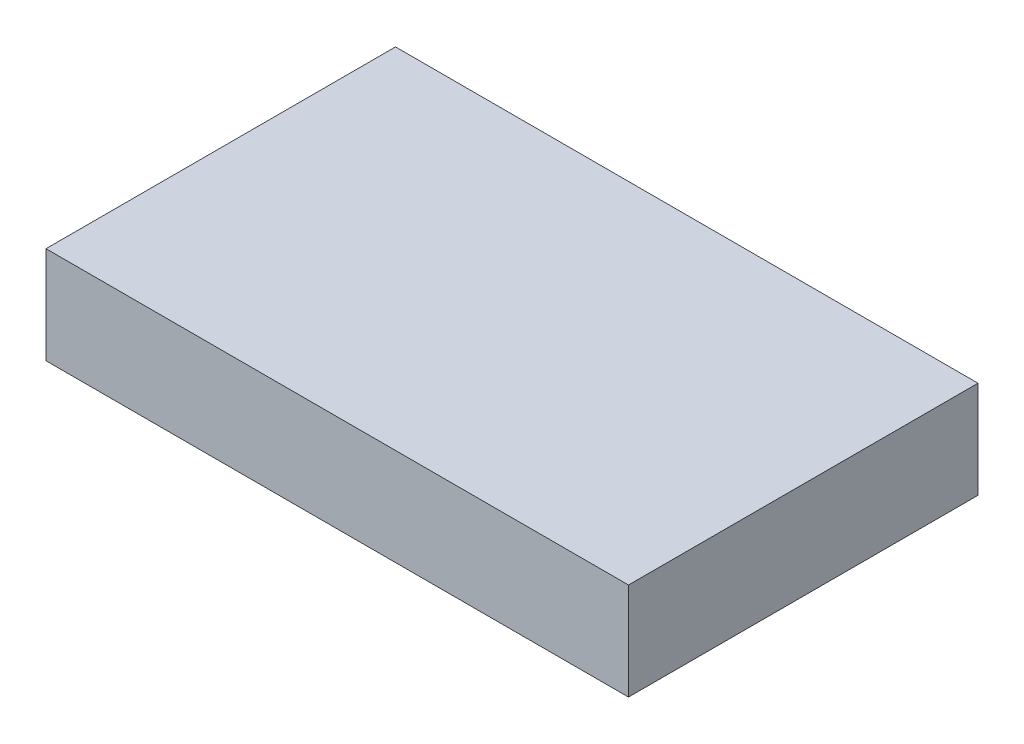
ISO-10303-21;
HEADER;
FILE_DESCRIPTION(('STEP AP214'),'2;1');
FILE_NAME('part.step','',(''),(''),'','','');
FILE_SCHEMA(('AUTOMOTIVE_DESIGN { 1 0 10303 214 1 1 1 1 }'));
ENDSEC;
DATA;
#1=APPLICATION_CONTEXT('core data for automotive mechanical design processes');
#2=APPLICATION_PROTOCOL_DEFINITION('international standard','automotive_design',2000,#1);
#3=PRODUCT_CONTEXT('',#1,'mechanical');
#4=PRODUCT('Part','Part','',(#3));
#5=PRODUCT_RELATED_PRODUCT_CATEGORY('part','',(#4));
#6=PRODUCT_DEFINITION_FORMATION('','',#4);
#7=PRODUCT_DEFINITION_CONTEXT('part definition',#1,'design');
#8=PRODUCT_DEFINITION('design','',#6,#7);
#9=PRODUCT_DEFINITION_SHAPE('','',#8);
#10=(LENGTH_UNIT() NAMED_UNIT(*) SI_UNIT(.MILLI.,.METRE.));
#11=(NAMED_UNIT(*) PLANE_ANGLE_UNIT() SI_UNIT($,.RADIAN.));
#12=(NAMED_UNIT(*) SI_UNIT($,.STERADIAN.) SOLID_ANGLE_UNIT());
#13=UNCERTAINTY_MEASURE_WITH_UNIT(LENGTH_MEASURE(1.E-05),#10,'distance_accuracy_value','');
#14=(GEOMETRIC_REPRESENTATION_CONTEXT(3) GLOBAL_UNCERTAINTY_ASSIGNED_CONTEXT((#13)) GLOBAL_UNIT_ASSIGNED_CONTEXT((#10,
#11,#12)) REPRESENTATION_CONTEXT('',''));
#15=CARTESIAN_POINT('',(0.,0.,0.));
#16=DIRECTION('',(0.,0.,1.));
#17=DIRECTION('',(1.,0.,0.));
#18=AXIS2_PLACEMENT_3D('',#15,#16,#17);
#19=CARTESIAN_POINT('',(0.,5.,0.));
#20=DIRECTION('',(1.,0.,0.));
#21=DIRECTION('',(0.,0.,-1.));
#22=AXIS2_PLACEMENT_3D('',#19,#20,#21);
#23=PLANE('',#22);
#24=DIRECTION('',(0.,0.,1.));
#25=VECTOR('',#24,1.);
#26=CARTESIAN_POINT('',(0.,0.,0.));
#27=LINE('',#26,#25);
#28=CARTESIAN_POINT('',(0.,0.,0.));
#29=VERTEX_POINT('',#28);
#30=CARTESIAN_POINT('',(0.,0.,18.));
#31=VERTEX_POINT('',#30);
#32=EDGE_CURVE('E98',#29,#31,#27,.T.);
#33=ORIENTED_EDGE('',*,*,#32,.T.);
#34=DIRECTION('',(0.,-1.,0.));
#35=VECTOR('',#34,1.);
#36=CARTESIAN_POINT('',(0.,5.,18.));
#37=LINE('',#36,#35);
#38=CARTESIAN_POINT('',(0.,5.,18.));
#39=VERTEX_POINT('',#38);
#40=EDGE_CURVE('E11',#39,#31,#37,.T.);
#41=ORIENTED_EDGE('',*,*,#40,.F.);
#42=DIRECTION('',(0.,0.,1.));
#43=VECTOR('',#42,1.);
#44=CARTESIAN_POINT('',(0.,5.,0.));
#45=LINE('',#44,#43);
#46=CARTESIAN_POINT('',(0.,5.,0.));
#47=VERTEX_POINT('',#46);
#48=EDGE_CURVE('E86',#47,#39,#45,.T.);
#49=ORIENTED_EDGE('',*,*,#48,.F.);
#50=DIRECTION('',(0.,-1.,0.));
#51=VECTOR('',#50,1.);
#52=CARTESIAN_POINT('',(0.,5.,0.));
#53=LINE('',#52,#51);
#54=EDGE_CURVE('E94',#47,#29,#53,.T.);
#55=ORIENTED_EDGE('',*,*,#54,.T.);
#56=EDGE_LOOP('',(#33,#41,#49,#55));
#57=FACE_BOUND('',#56,.T.);
#58=ADVANCED_FACE('F35',(#57),#23,.F.);
#59=CARTESIAN_POINT('',(0.,5.,18.));
#60=DIRECTION('',(0.,0.,-1.));
#61=DIRECTION('',(-1.,0.,0.));
#62=AXIS2_PLACEMENT_3D('',#59,#60,#61);
#63=PLANE('',#62);
#64=DIRECTION('',(1.,0.,0.));
#65=VECTOR('',#64,1.);
#66=CARTESIAN_POINT('',(0.,0.,18.));
#67=LINE('',#66,#65);
#68=CARTESIAN_POINT('',(30.,0.,18.));
#69=VERTEX_POINT('',#68);
#70=EDGE_CURVE('E90',#31,#69,#67,.T.);
#71=ORIENTED_EDGE('',*,*,#70,.T.);
#72=DIRECTION('',(0.,-1.,0.));
#73=VECTOR('',#72,1.);
#74=CARTESIAN_POINT('',(30.,5.,18.));
#75=LINE('',#74,#73);
#76=CARTESIAN_POINT('',(30.,5.,18.));
#77=VERTEX_POINT('',#76);
#78=EDGE_CURVE('E43',#77,#69,#75,.T.);
#79=ORIENTED_EDGE('',*,*,#78,.F.);
#80=DIRECTION('',(1.,0.,0.));
#81=VECTOR('',#80,1.);
#82=CARTESIAN_POINT('',(0.,5.,18.));
#83=LINE('',#82,#81);
#84=EDGE_CURVE('E81',#39,#77,#83,.T.);
#85=ORIENTED_EDGE('',*,*,#84,.F.);
#86=ORIENTED_EDGE('',*,*,#40,.T.);
#87=EDGE_LOOP('',(#71,#79,#85,#86));
#88=FACE_BOUND('',#87,.T.);
#89=ADVANCED_FACE('F89',(#88),#63,.F.);
#90=CARTESIAN_POINT('',(30.,5.,0.));
#91=DIRECTION('',(-1.,0.,0.));
#92=DIRECTION('',(0.,0.,1.));
#93=AXIS2_PLACEMENT_3D('',#90,#91,#92);
#94=PLANE('',#93);
#95=DIRECTION('',(0.,0.,-1.));
#96=VECTOR('',#95,1.);
#97=CARTESIAN_POINT('',(30.,0.,0.));
#98=LINE('',#97,#96);
#99=CARTESIAN_POINT('',(30.,0.,0.));
#100=VERTEX_POINT('',#99);
#101=EDGE_CURVE('E68',#69,#100,#98,.T.);
#102=ORIENTED_EDGE('',*,*,#101,.T.);
#103=DIRECTION('',(0.,-1.,0.));
#104=VECTOR('',#103,1.);
#105=CARTESIAN_POINT('',(30.,5.,0.));
#106=LINE('',#105,#104);
#107=CARTESIAN_POINT('',(30.,5.,0.));
#108=VERTEX_POINT('',#107);
#109=EDGE_CURVE('E91',#108,#100,#106,.T.);
#110=ORIENTED_EDGE('',*,*,#109,.F.);
#111=DIRECTION('',(0.,0.,-1.));
#112=VECTOR('',#111,1.);
#113=CARTESIAN_POINT('',(30.,5.,0.));
#114=LINE('',#113,#112);
#115=EDGE_CURVE('E84',#77,#108,#114,.T.);
#116=ORIENTED_EDGE('',*,*,#115,.F.);
#117=ORIENTED_EDGE('',*,*,#78,.T.);
#118=EDGE_LOOP('',(#102,#110,#116,#117));
#119=FACE_BOUND('',#118,.T.);
#120=ADVANCED_FACE('F92',(#119),#94,.F.);
#121=CARTESIAN_POINT('',(0.,5.,0.));
#122=DIRECTION('',(0.,0.,1.));
#123=DIRECTION('',(1.,0.,0.));
#124=AXIS2_PLACEMENT_3D('',#121,#122,#123);
#125=PLANE('',#124);
#126=DIRECTION('',(-1.,0.,0.));
#127=VECTOR('',#126,1.);
#128=CARTESIAN_POINT('',(0.,0.,0.));
#129=LINE('',#128,#127);
#130=EDGE_CURVE('E74',#100,#29,#129,.T.);
#131=ORIENTED_EDGE('',*,*,#130,.T.);
#132=ORIENTED_EDGE('',*,*,#54,.F.);
#133=DIRECTION('',(-1.,0.,0.));
#134=VECTOR('',#133,1.);
#135=CARTESIAN_POINT('',(0.,5.,0.));
#136=LINE('',#135,#134);
#137=EDGE_CURVE('E51',#108,#47,#136,.T.);
#138=ORIENTED_EDGE('',*,*,#137,.F.);
#139=ORIENTED_EDGE('',*,*,#109,.T.);
#140=EDGE_LOOP('',(#131,#132,#138,#139));
#141=FACE_BOUND('',#140,.T.);
#142=ADVANCED_FACE('F105',(#141),#125,.F.);
#143=CARTESIAN_POINT('',(0.,5.,0.));
#144=DIRECTION('',(0.,1.,0.));
#145=DIRECTION('',(0.,0.,1.));
#146=AXIS2_PLACEMENT_3D('',#143,#144,#145);
#147=PLANE('',#146);
#148=ORIENTED_EDGE('',*,*,#48,.T.);
#149=ORIENTED_EDGE('',*,*,#84,.T.);
#150=ORIENTED_EDGE('',*,*,#115,.T.);
#151=ORIENTED_EDGE('',*,*,#137,.T.);
#152=EDGE_LOOP('',(#148,#149,#150,#151));
#153=FACE_BOUND('',#152,.T.);
#154=ADVANCED_FACE('F82',(#153),#147,.T.);
#155=CARTESIAN_POINT('',(0.,0.,0.));
#156=DIRECTION('',(0.,1.,0.));
#157=DIRECTION('',(0.,0.,1.));
#158=AXIS2_PLACEMENT_3D('',#155,#156,#157);
#159=PLANE('',#158);
#160=ORIENTED_EDGE('',*,*,#32,.F.);
#161=ORIENTED_EDGE('',*,*,#130,.F.);
#162=ORIENTED_EDGE('',*,*,#101,.F.);
#163=ORIENTED_EDGE('',*,*,#70,.F.);
#164=EDGE_LOOP('',(#160,#161,#162,#163));
#165=FACE_BOUND('',#164,.T.);
#166=ADVANCED_FACE('F108',(#165),#159,.F.);
#167=CLOSED_SHELL('',(#58,#89,#120,#142,#154,#166));
#168=MANIFOLD_SOLID_BREP('B2',#167);
#169=ADVANCED_BREP_SHAPE_REPRESENTATION('',(#18,#168),#14);
#170=SHAPE_DEFINITION_REPRESENTATION(#9,#169);
ENDSEC;
END-ISO-10303-21;
